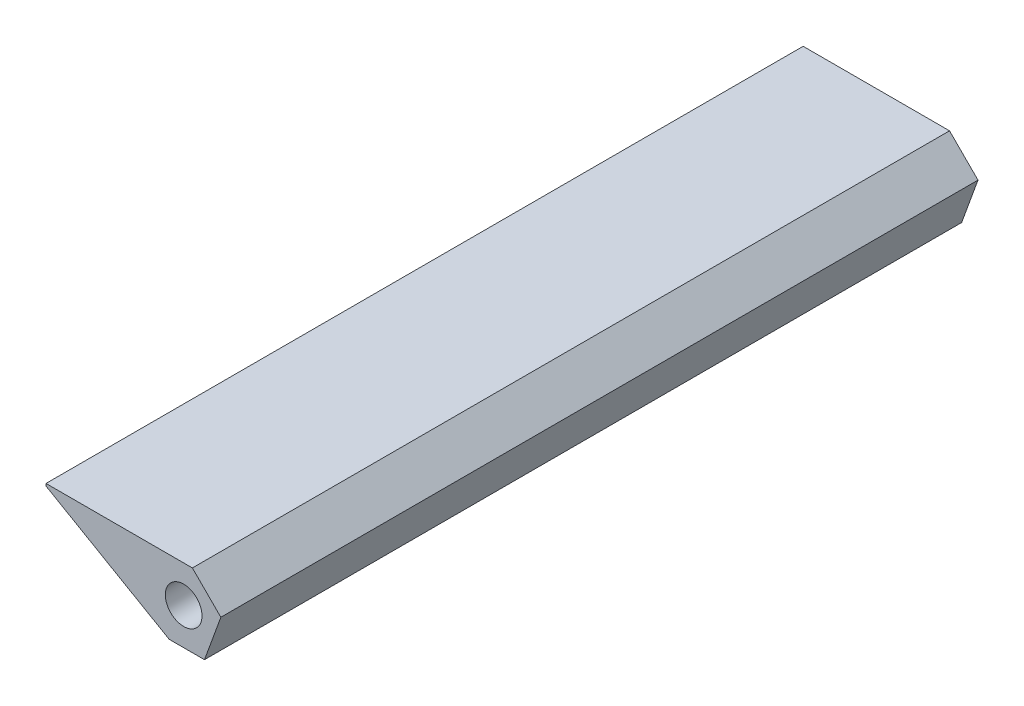
ISO-10303-21;
HEADER;
FILE_DESCRIPTION(('STEP AP214'),'2;1');
FILE_NAME('part.step','',(''),(''),'','','');
FILE_SCHEMA(('AUTOMOTIVE_DESIGN { 1 0 10303 214 1 1 1 1 }'));
ENDSEC;
DATA;
#1=APPLICATION_CONTEXT('core data for automotive mechanical design processes');
#2=APPLICATION_PROTOCOL_DEFINITION('international standard','automotive_design',2000,#1);
#3=PRODUCT_CONTEXT('',#1,'mechanical');
#4=PRODUCT('Part','Part','',(#3));
#5=PRODUCT_RELATED_PRODUCT_CATEGORY('part','',(#4));
#6=PRODUCT_DEFINITION_FORMATION('','',#4);
#7=PRODUCT_DEFINITION_CONTEXT('part definition',#1,'design');
#8=PRODUCT_DEFINITION('design','',#6,#7);
#9=PRODUCT_DEFINITION_SHAPE('','',#8);
#10=(LENGTH_UNIT() NAMED_UNIT(*) SI_UNIT(.MILLI.,.METRE.));
#11=(NAMED_UNIT(*) PLANE_ANGLE_UNIT() SI_UNIT($,.RADIAN.));
#12=(NAMED_UNIT(*) SI_UNIT($,.STERADIAN.) SOLID_ANGLE_UNIT());
#13=UNCERTAINTY_MEASURE_WITH_UNIT(LENGTH_MEASURE(1.E-05),#10,'distance_accuracy_value','');
#14=(GEOMETRIC_REPRESENTATION_CONTEXT(3) GLOBAL_UNCERTAINTY_ASSIGNED_CONTEXT((#13)) GLOBAL_UNIT_ASSIGNED_CONTEXT((#10,
#11,#12)) REPRESENTATION_CONTEXT('',''));
#15=CARTESIAN_POINT('',(0.,0.,0.));
#16=DIRECTION('',(0.,0.,1.));
#17=DIRECTION('',(1.,0.,0.));
#18=AXIS2_PLACEMENT_3D('',#15,#16,#17);
#19=CARTESIAN_POINT('',(0.,0.,82.5));
#20=DIRECTION('',(0.,0.,-1.));
#21=DIRECTION('',(-1.,0.,0.));
#22=AXIS2_PLACEMENT_3D('',#19,#20,#21);
#23=PLANE('',#22);
#24=DIRECTION('',(0.,-1.,0.));
#25=VECTOR('',#24,1.);
#26=CARTESIAN_POINT('',(-29.9999999999999,7.5,82.5));
#27=LINE('',#26,#25);
#28=CARTESIAN_POINT('',(-30.,8.,82.5));
#29=VERTEX_POINT('',#28);
#30=CARTESIAN_POINT('',(-29.9999999999999,7.5,82.5));
#31=VERTEX_POINT('',#30);
#32=EDGE_CURVE('E128',#29,#31,#27,.T.);
#33=ORIENTED_EDGE('',*,*,#32,.T.);
#34=DIRECTION('',(0.866025403784441,-0.499999999999995,0.));
#35=VECTOR('',#34,1.);
#36=CARTESIAN_POINT('',(-3.15321248268202,-8.,82.5));
#37=LINE('',#36,#35);
#38=CARTESIAN_POINT('',(-3.15321248268202,-8.,82.5));
#39=VERTEX_POINT('',#38);
#40=EDGE_CURVE('E86',#31,#39,#37,.T.);
#41=ORIENTED_EDGE('',*,*,#40,.T.);
#42=DIRECTION('',(1.,0.,0.));
#43=VECTOR('',#42,1.);
#44=CARTESIAN_POINT('',(4.53748253320174,-8.,82.5));
#45=LINE('',#44,#43);
#46=CARTESIAN_POINT('',(4.53748253320174,-8.,82.5));
#47=VERTEX_POINT('',#46);
#48=EDGE_CURVE('E99',#39,#47,#45,.T.);
#49=ORIENTED_EDGE('',*,*,#48,.T.);
#50=DIRECTION('',(0.342020143325672,0.939692620785907,0.));
#51=VECTOR('',#50,1.);
#52=CARTESIAN_POINT('',(8.10308437887061,1.79641055774099,82.5));
#53=LINE('',#52,#51);
#54=CARTESIAN_POINT('',(8.10308437887061,1.79641055774099,82.5));
#55=VERTEX_POINT('',#54);
#56=EDGE_CURVE('E93',#47,#55,#53,.T.);
#57=ORIENTED_EDGE('',*,*,#56,.T.);
#58=DIRECTION('',(-0.707106781186546,0.707106781186548,0.));
#59=VECTOR('',#58,1.);
#60=CARTESIAN_POINT('',(1.89949493661173,8.,82.5));
#61=LINE('',#60,#59);
#62=CARTESIAN_POINT('',(1.89949493661173,8.,82.5));
#63=VERTEX_POINT('',#62);
#64=EDGE_CURVE('E97',#55,#63,#61,.T.);
#65=ORIENTED_EDGE('',*,*,#64,.T.);
#66=DIRECTION('',(-1.,0.,0.));
#67=VECTOR('',#66,1.);
#68=CARTESIAN_POINT('',(-30.,8.,82.5));
#69=LINE('',#68,#67);
#70=EDGE_CURVE('E49',#63,#29,#69,.T.);
#71=ORIENTED_EDGE('',*,*,#70,.T.);
#72=EDGE_LOOP('',(#33,#41,#49,#57,#65,#71));
#73=FACE_BOUND('',#72,.T.);
#74=CARTESIAN_POINT('',(0.,0.,82.5));
#75=DIRECTION('',(0.,0.,1.));
#76=DIRECTION('',(1.,0.,0.));
#77=AXIS2_PLACEMENT_3D('',#74,#75,#76);
#78=CIRCLE('',#77,4.);
#79=CARTESIAN_POINT('',(4.,0.,82.5));
#80=VERTEX_POINT('',#79);
#81=EDGE_CURVE('E121',#80,#80,#78,.T.);
#82=ORIENTED_EDGE('',*,*,#81,.F.);
#83=EDGE_LOOP('',(#82));
#84=FACE_BOUND('',#83,.T.);
#85=ADVANCED_FACE('F32',(#73,#84),#23,.F.);
#86=CARTESIAN_POINT('',(0.,0.,-82.5));
#87=DIRECTION('',(0.,0.,-1.));
#88=DIRECTION('',(-1.,0.,0.));
#89=AXIS2_PLACEMENT_3D('',#86,#87,#88);
#90=PLANE('',#89);
#91=DIRECTION('',(0.,-1.,0.));
#92=VECTOR('',#91,1.);
#93=CARTESIAN_POINT('',(-29.9999999999999,7.5,-82.5));
#94=LINE('',#93,#92);
#95=CARTESIAN_POINT('',(-30.,8.,-82.5));
#96=VERTEX_POINT('',#95);
#97=CARTESIAN_POINT('',(-29.9999999999999,7.5,-82.5));
#98=VERTEX_POINT('',#97);
#99=EDGE_CURVE('E117',#96,#98,#94,.T.);
#100=ORIENTED_EDGE('',*,*,#99,.F.);
#101=DIRECTION('',(-1.,0.,0.));
#102=VECTOR('',#101,1.);
#103=CARTESIAN_POINT('',(-30.,8.,-82.5));
#104=LINE('',#103,#102);
#105=CARTESIAN_POINT('',(1.89949493661173,8.,-82.5));
#106=VERTEX_POINT('',#105);
#107=EDGE_CURVE('E78',#106,#96,#104,.T.);
#108=ORIENTED_EDGE('',*,*,#107,.F.);
#109=DIRECTION('',(-0.707106781186546,0.707106781186548,0.));
#110=VECTOR('',#109,1.);
#111=CARTESIAN_POINT('',(1.89949493661173,8.,-82.5));
#112=LINE('',#111,#110);
#113=CARTESIAN_POINT('',(8.10308437887061,1.79641055774099,-82.5));
#114=VERTEX_POINT('',#113);
#115=EDGE_CURVE('E72',#114,#106,#112,.T.);
#116=ORIENTED_EDGE('',*,*,#115,.F.);
#117=DIRECTION('',(0.342020143325672,0.939692620785907,0.));
#118=VECTOR('',#117,1.);
#119=CARTESIAN_POINT('',(8.10308437887061,1.79641055774099,-82.5));
#120=LINE('',#119,#118);
#121=CARTESIAN_POINT('',(4.53748253320174,-8.,-82.5));
#122=VERTEX_POINT('',#121);
#123=EDGE_CURVE('E107',#122,#114,#120,.T.);
#124=ORIENTED_EDGE('',*,*,#123,.F.);
#125=DIRECTION('',(1.,0.,0.));
#126=VECTOR('',#125,1.);
#127=CARTESIAN_POINT('',(4.53748253320174,-8.,-82.5));
#128=LINE('',#127,#126);
#129=CARTESIAN_POINT('',(-3.15321248268202,-8.,-82.5));
#130=VERTEX_POINT('',#129);
#131=EDGE_CURVE('E123',#130,#122,#128,.T.);
#132=ORIENTED_EDGE('',*,*,#131,.F.);
#133=DIRECTION('',(0.866025403784441,-0.499999999999995,0.));
#134=VECTOR('',#133,1.);
#135=CARTESIAN_POINT('',(-3.15321248268202,-8.,-82.5));
#136=LINE('',#135,#134);
#137=EDGE_CURVE('E120',#98,#130,#136,.T.);
#138=ORIENTED_EDGE('',*,*,#137,.F.);
#139=EDGE_LOOP('',(#100,#108,#116,#124,#132,#138));
#140=FACE_BOUND('',#139,.T.);
#141=CARTESIAN_POINT('',(0.,0.,-82.5));
#142=DIRECTION('',(0.,0.,1.));
#143=DIRECTION('',(1.,0.,0.));
#144=AXIS2_PLACEMENT_3D('',#141,#142,#143);
#145=CIRCLE('',#144,4.);
#146=CARTESIAN_POINT('',(4.,0.,-82.5));
#147=VERTEX_POINT('',#146);
#148=EDGE_CURVE('E203',#147,#147,#145,.T.);
#149=ORIENTED_EDGE('',*,*,#148,.T.);
#150=EDGE_LOOP('',(#149));
#151=FACE_BOUND('',#150,.T.);
#152=ADVANCED_FACE('F137',(#140,#151),#90,.T.);
#153=CARTESIAN_POINT('',(-29.9999999999999,7.5,82.5));
#154=DIRECTION('',(1.,0.,0.));
#155=DIRECTION('',(0.,0.,-1.));
#156=AXIS2_PLACEMENT_3D('',#153,#154,#155);
#157=PLANE('',#156);
#158=ORIENTED_EDGE('',*,*,#99,.T.);
#159=DIRECTION('',(0.,0.,-1.));
#160=VECTOR('',#159,1.);
#161=CARTESIAN_POINT('',(-29.9999999999999,7.5,82.5));
#162=LINE('',#161,#160);
#163=EDGE_CURVE('E11',#31,#98,#162,.T.);
#164=ORIENTED_EDGE('',*,*,#163,.F.);
#165=ORIENTED_EDGE('',*,*,#32,.F.);
#166=DIRECTION('',(0.,0.,-1.));
#167=VECTOR('',#166,1.);
#168=CARTESIAN_POINT('',(-30.,8.,82.5));
#169=LINE('',#168,#167);
#170=EDGE_CURVE('E113',#29,#96,#169,.T.);
#171=ORIENTED_EDGE('',*,*,#170,.T.);
#172=EDGE_LOOP('',(#158,#164,#165,#171));
#173=FACE_BOUND('',#172,.T.);
#174=ADVANCED_FACE('F34',(#173),#157,.F.);
#175=CARTESIAN_POINT('',(-3.15321248268202,-8.,82.5));
#176=DIRECTION('',(0.499999999999995,0.866025403784442,0.));
#177=DIRECTION('',(-0.866025403784442,0.499999999999995,0.));
#178=AXIS2_PLACEMENT_3D('',#175,#176,#177);
#179=PLANE('',#178);
#180=ORIENTED_EDGE('',*,*,#137,.T.);
#181=DIRECTION('',(0.,0.,-1.));
#182=VECTOR('',#181,1.);
#183=CARTESIAN_POINT('',(-3.15321248268202,-8.,82.5));
#184=LINE('',#183,#182);
#185=EDGE_CURVE('E41',#39,#130,#184,.T.);
#186=ORIENTED_EDGE('',*,*,#185,.F.);
#187=ORIENTED_EDGE('',*,*,#40,.F.);
#188=ORIENTED_EDGE('',*,*,#163,.T.);
#189=EDGE_LOOP('',(#180,#186,#187,#188));
#190=FACE_BOUND('',#189,.T.);
#191=ADVANCED_FACE('F162',(#190),#179,.F.);
#192=CARTESIAN_POINT('',(4.53748253320174,-8.,82.5));
#193=DIRECTION('',(0.,1.,0.));
#194=DIRECTION('',(-1.,0.,0.));
#195=AXIS2_PLACEMENT_3D('',#192,#193,#194);
#196=PLANE('',#195);
#197=ORIENTED_EDGE('',*,*,#131,.T.);
#198=DIRECTION('',(0.,0.,-1.));
#199=VECTOR('',#198,1.);
#200=CARTESIAN_POINT('',(4.53748253320174,-8.,82.5));
#201=LINE('',#200,#199);
#202=EDGE_CURVE('E108',#47,#122,#201,.T.);
#203=ORIENTED_EDGE('',*,*,#202,.F.);
#204=ORIENTED_EDGE('',*,*,#48,.F.);
#205=ORIENTED_EDGE('',*,*,#185,.T.);
#206=EDGE_LOOP('',(#197,#203,#204,#205));
#207=FACE_BOUND('',#206,.T.);
#208=ADVANCED_FACE('F134',(#207),#196,.F.);
#209=CARTESIAN_POINT('',(8.10308437887061,1.79641055774099,82.5));
#210=DIRECTION('',(-0.939692620785907,0.342020143325672,0.));
#211=DIRECTION('',(-0.342020143325672,-0.939692620785907,0.));
#212=AXIS2_PLACEMENT_3D('',#209,#210,#211);
#213=PLANE('',#212);
#214=ORIENTED_EDGE('',*,*,#123,.T.);
#215=DIRECTION('',(0.,0.,-1.));
#216=VECTOR('',#215,1.);
#217=CARTESIAN_POINT('',(8.10308437887061,1.79641055774099,82.5));
#218=LINE('',#217,#216);
#219=EDGE_CURVE('E104',#55,#114,#218,.T.);
#220=ORIENTED_EDGE('',*,*,#219,.F.);
#221=ORIENTED_EDGE('',*,*,#56,.F.);
#222=ORIENTED_EDGE('',*,*,#202,.T.);
#223=EDGE_LOOP('',(#214,#220,#221,#222));
#224=FACE_BOUND('',#223,.T.);
#225=ADVANCED_FACE('F105',(#224),#213,.F.);
#226=CARTESIAN_POINT('',(1.89949493661173,8.,82.5));
#227=DIRECTION('',(-0.707106781186548,-0.707106781186546,0.));
#228=DIRECTION('',(0.707106781186546,-0.707106781186548,0.));
#229=AXIS2_PLACEMENT_3D('',#226,#227,#228);
#230=PLANE('',#229);
#231=ORIENTED_EDGE('',*,*,#115,.T.);
#232=DIRECTION('',(0.,0.,-1.));
#233=VECTOR('',#232,1.);
#234=CARTESIAN_POINT('',(1.89949493661173,8.,82.5));
#235=LINE('',#234,#233);
#236=EDGE_CURVE('E109',#63,#106,#235,.T.);
#237=ORIENTED_EDGE('',*,*,#236,.F.);
#238=ORIENTED_EDGE('',*,*,#64,.F.);
#239=ORIENTED_EDGE('',*,*,#219,.T.);
#240=EDGE_LOOP('',(#231,#237,#238,#239));
#241=FACE_BOUND('',#240,.T.);
#242=ADVANCED_FACE('F111',(#241),#230,.F.);
#243=CARTESIAN_POINT('',(-30.,8.,82.5));
#244=DIRECTION('',(0.,-1.,0.));
#245=DIRECTION('',(0.,0.,-1.));
#246=AXIS2_PLACEMENT_3D('',#243,#244,#245);
#247=PLANE('',#246);
#248=ORIENTED_EDGE('',*,*,#107,.T.);
#249=ORIENTED_EDGE('',*,*,#170,.F.);
#250=ORIENTED_EDGE('',*,*,#70,.F.);
#251=ORIENTED_EDGE('',*,*,#236,.T.);
#252=EDGE_LOOP('',(#248,#249,#250,#251));
#253=FACE_BOUND('',#252,.T.);
#254=ADVANCED_FACE('F142',(#253),#247,.F.);
#255=CARTESIAN_POINT('',(0.,0.,82.5));
#256=DIRECTION('',(0.,0.,-1.));
#257=DIRECTION('',(-1.,0.,0.));
#258=AXIS2_PLACEMENT_3D('',#255,#256,#257);
#259=CYLINDRICAL_SURFACE('',#258,4.);
#260=ORIENTED_EDGE('',*,*,#81,.T.);
#261=EDGE_LOOP('',(#260));
#262=FACE_BOUND('',#261,.T.);
#263=ORIENTED_EDGE('',*,*,#148,.F.);
#264=EDGE_LOOP('',(#263));
#265=FACE_BOUND('',#264,.T.);
#266=ADVANCED_FACE('F144',(#262,#265),#259,.F.);
#267=CLOSED_SHELL('',(#85,#152,#174,#191,#208,#225,#242,#254,#266));
#268=MANIFOLD_SOLID_BREP('B2',#267);
#269=ADVANCED_BREP_SHAPE_REPRESENTATION('',(#18,#268),#14);
#270=SHAPE_DEFINITION_REPRESENTATION(#9,#269);
ENDSEC;
END-ISO-10303-21;
